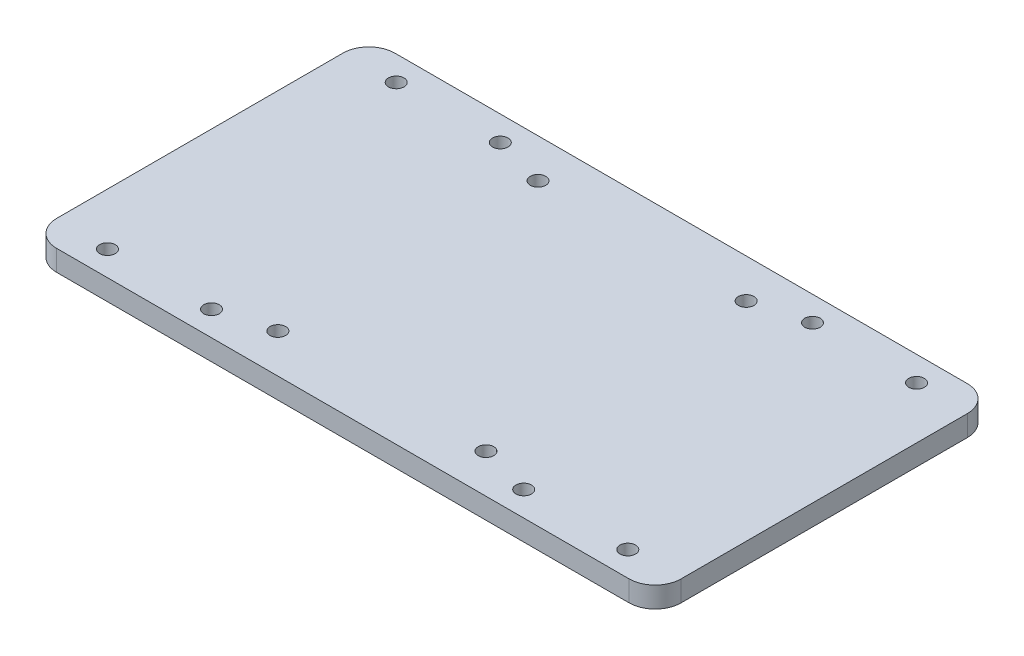
ISO-10303-21;
HEADER;
FILE_DESCRIPTION(('STEP AP214'),'2;1');
FILE_NAME('part.step','',(''),(''),'','','');
FILE_SCHEMA(('AUTOMOTIVE_DESIGN { 1 0 10303 214 1 1 1 1 }'));
ENDSEC;
DATA;
#1=APPLICATION_CONTEXT('core data for automotive mechanical design processes');
#2=APPLICATION_PROTOCOL_DEFINITION('international standard','automotive_design',2000,#1);
#3=PRODUCT_CONTEXT('',#1,'mechanical');
#4=PRODUCT('Part','Part','',(#3));
#5=PRODUCT_RELATED_PRODUCT_CATEGORY('part','',(#4));
#6=PRODUCT_DEFINITION_FORMATION('','',#4);
#7=PRODUCT_DEFINITION_CONTEXT('part definition',#1,'design');
#8=PRODUCT_DEFINITION('design','',#6,#7);
#9=PRODUCT_DEFINITION_SHAPE('','',#8);
#10=(LENGTH_UNIT() NAMED_UNIT(*) SI_UNIT(.MILLI.,.METRE.));
#11=(NAMED_UNIT(*) PLANE_ANGLE_UNIT() SI_UNIT($,.RADIAN.));
#12=(NAMED_UNIT(*) SI_UNIT($,.STERADIAN.) SOLID_ANGLE_UNIT());
#13=UNCERTAINTY_MEASURE_WITH_UNIT(LENGTH_MEASURE(1.E-05),#10,'distance_accuracy_value','');
#14=(GEOMETRIC_REPRESENTATION_CONTEXT(3) GLOBAL_UNCERTAINTY_ASSIGNED_CONTEXT((#13)) GLOBAL_UNIT_ASSIGNED_CONTEXT((#10,
#11,#12)) REPRESENTATION_CONTEXT('',''));
#15=CARTESIAN_POINT('',(0.,0.,0.));
#16=DIRECTION('',(0.,0.,1.));
#17=DIRECTION('',(1.,0.,0.));
#18=AXIS2_PLACEMENT_3D('',#15,#16,#17);
#19=CARTESIAN_POINT('',(60.,4.,32.5));
#20=DIRECTION('',(-1.,0.,0.));
#21=DIRECTION('',(0.,0.,1.));
#22=AXIS2_PLACEMENT_3D('',#19,#20,#21);
#23=PLANE('',#22);
#24=DIRECTION('',(0.,0.,-1.));
#25=VECTOR('',#24,1.);
#26=CARTESIAN_POINT('',(60.,4.,32.5));
#27=LINE('',#26,#25);
#28=CARTESIAN_POINT('',(60.,4.,27.5));
#29=VERTEX_POINT('',#28);
#30=CARTESIAN_POINT('',(60.,4.,-27.5));
#31=VERTEX_POINT('',#30);
#32=EDGE_CURVE('E133',#29,#31,#27,.T.);
#33=ORIENTED_EDGE('',*,*,#32,.F.);
#34=DIRECTION('',(0.,-1.,0.));
#35=VECTOR('',#34,1.);
#36=CARTESIAN_POINT('',(60.,4.,27.5));
#37=LINE('',#36,#35);
#38=CARTESIAN_POINT('',(60.,0.,27.5));
#39=VERTEX_POINT('',#38);
#40=EDGE_CURVE('E159',#29,#39,#37,.T.);
#41=ORIENTED_EDGE('',*,*,#40,.T.);
#42=DIRECTION('',(0.,0.,-1.));
#43=VECTOR('',#42,1.);
#44=CARTESIAN_POINT('',(60.,0.,32.5));
#45=LINE('',#44,#43);
#46=CARTESIAN_POINT('',(60.,0.,-27.5));
#47=VERTEX_POINT('',#46);
#48=EDGE_CURVE('E165',#39,#47,#45,.T.);
#49=ORIENTED_EDGE('',*,*,#48,.T.);
#50=DIRECTION('',(0.,-1.,0.));
#51=VECTOR('',#50,1.);
#52=CARTESIAN_POINT('',(60.,4.,-27.5));
#53=LINE('',#52,#51);
#54=EDGE_CURVE('E157',#47,#31,#53,.F.);
#55=ORIENTED_EDGE('',*,*,#54,.T.);
#56=EDGE_LOOP('',(#33,#41,#49,#55));
#57=FACE_BOUND('',#56,.T.);
#58=ADVANCED_FACE('F41',(#57),#23,.F.);
#59=CARTESIAN_POINT('',(-60.,4.,-32.5));
#60=DIRECTION('',(0.,0.,1.));
#61=DIRECTION('',(1.,0.,0.));
#62=AXIS2_PLACEMENT_3D('',#59,#60,#61);
#63=PLANE('',#62);
#64=DIRECTION('',(-1.,0.,0.));
#65=VECTOR('',#64,1.);
#66=CARTESIAN_POINT('',(-60.,4.,-32.5));
#67=LINE('',#66,#65);
#68=CARTESIAN_POINT('',(55.,4.,-32.5));
#69=VERTEX_POINT('',#68);
#70=CARTESIAN_POINT('',(-55.,4.,-32.5));
#71=VERTEX_POINT('',#70);
#72=EDGE_CURVE('E136',#69,#71,#67,.T.);
#73=ORIENTED_EDGE('',*,*,#72,.F.);
#74=DIRECTION('',(0.,-1.,0.));
#75=VECTOR('',#74,1.);
#76=CARTESIAN_POINT('',(55.,4.,-32.5));
#77=LINE('',#76,#75);
#78=CARTESIAN_POINT('',(55.,0.,-32.5));
#79=VERTEX_POINT('',#78);
#80=EDGE_CURVE('E11',#69,#79,#77,.T.);
#81=ORIENTED_EDGE('',*,*,#80,.T.);
#82=DIRECTION('',(-1.,0.,0.));
#83=VECTOR('',#82,1.);
#84=CARTESIAN_POINT('',(-60.,0.,-32.5));
#85=LINE('',#84,#83);
#86=CARTESIAN_POINT('',(-55.,0.,-32.5));
#87=VERTEX_POINT('',#86);
#88=EDGE_CURVE('E138',#79,#87,#85,.T.);
#89=ORIENTED_EDGE('',*,*,#88,.T.);
#90=DIRECTION('',(0.,-1.,0.));
#91=VECTOR('',#90,1.);
#92=CARTESIAN_POINT('',(-55.,4.,-32.5));
#93=LINE('',#92,#91);
#94=EDGE_CURVE('E49',#87,#71,#93,.F.);
#95=ORIENTED_EDGE('',*,*,#94,.T.);
#96=EDGE_LOOP('',(#73,#81,#89,#95));
#97=FACE_BOUND('',#96,.T.);
#98=ADVANCED_FACE('F280',(#97),#63,.F.);
#99=CARTESIAN_POINT('',(-60.,4.,32.5));
#100=DIRECTION('',(1.,0.,0.));
#101=DIRECTION('',(0.,0.,-1.));
#102=AXIS2_PLACEMENT_3D('',#99,#100,#101);
#103=PLANE('',#102);
#104=DIRECTION('',(0.,0.,1.));
#105=VECTOR('',#104,1.);
#106=CARTESIAN_POINT('',(-60.,0.,32.5));
#107=LINE('',#106,#105);
#108=CARTESIAN_POINT('',(-60.,0.,-27.5));
#109=VERTEX_POINT('',#108);
#110=CARTESIAN_POINT('',(-60.,0.,27.5));
#111=VERTEX_POINT('',#110);
#112=EDGE_CURVE('E134',#109,#111,#107,.T.);
#113=ORIENTED_EDGE('',*,*,#112,.T.);
#114=DIRECTION('',(0.,-1.,0.));
#115=VECTOR('',#114,1.);
#116=CARTESIAN_POINT('',(-60.,4.,27.5));
#117=LINE('',#116,#115);
#118=CARTESIAN_POINT('',(-60.,4.,27.5));
#119=VERTEX_POINT('',#118);
#120=EDGE_CURVE('E112',#111,#119,#117,.F.);
#121=ORIENTED_EDGE('',*,*,#120,.T.);
#122=DIRECTION('',(0.,0.,1.));
#123=VECTOR('',#122,1.);
#124=CARTESIAN_POINT('',(-60.,4.,32.5));
#125=LINE('',#124,#123);
#126=CARTESIAN_POINT('',(-60.,4.,-27.5));
#127=VERTEX_POINT('',#126);
#128=EDGE_CURVE('E177',#127,#119,#125,.T.);
#129=ORIENTED_EDGE('',*,*,#128,.F.);
#130=DIRECTION('',(0.,-1.,0.));
#131=VECTOR('',#130,1.);
#132=CARTESIAN_POINT('',(-60.,4.,-27.5));
#133=LINE('',#132,#131);
#134=EDGE_CURVE('E117',#127,#109,#133,.T.);
#135=ORIENTED_EDGE('',*,*,#134,.T.);
#136=EDGE_LOOP('',(#113,#121,#129,#135));
#137=FACE_BOUND('',#136,.T.);
#138=ADVANCED_FACE('F278',(#137),#103,.F.);
#139=CARTESIAN_POINT('',(-60.,4.,32.5));
#140=DIRECTION('',(0.,0.,-1.));
#141=DIRECTION('',(-1.,0.,0.));
#142=AXIS2_PLACEMENT_3D('',#139,#140,#141);
#143=PLANE('',#142);
#144=DIRECTION('',(1.,0.,0.));
#145=VECTOR('',#144,1.);
#146=CARTESIAN_POINT('',(-60.,4.,32.5));
#147=LINE('',#146,#145);
#148=CARTESIAN_POINT('',(-55.,4.,32.5));
#149=VERTEX_POINT('',#148);
#150=CARTESIAN_POINT('',(55.,4.,32.5));
#151=VERTEX_POINT('',#150);
#152=EDGE_CURVE('E127',#149,#151,#147,.T.);
#153=ORIENTED_EDGE('',*,*,#152,.F.);
#154=DIRECTION('',(0.,-1.,0.));
#155=VECTOR('',#154,1.);
#156=CARTESIAN_POINT('',(-55.,4.,32.5));
#157=LINE('',#156,#155);
#158=CARTESIAN_POINT('',(-55.,0.,32.5));
#159=VERTEX_POINT('',#158);
#160=EDGE_CURVE('E111',#149,#159,#157,.T.);
#161=ORIENTED_EDGE('',*,*,#160,.T.);
#162=DIRECTION('',(1.,0.,0.));
#163=VECTOR('',#162,1.);
#164=CARTESIAN_POINT('',(-60.,0.,32.5));
#165=LINE('',#164,#163);
#166=CARTESIAN_POINT('',(55.,0.,32.5));
#167=VERTEX_POINT('',#166);
#168=EDGE_CURVE('E124',#159,#167,#165,.T.);
#169=ORIENTED_EDGE('',*,*,#168,.T.);
#170=DIRECTION('',(0.,-1.,0.));
#171=VECTOR('',#170,1.);
#172=CARTESIAN_POINT('',(55.,4.,32.5));
#173=LINE('',#172,#171);
#174=EDGE_CURVE('E129',#167,#151,#173,.F.);
#175=ORIENTED_EDGE('',*,*,#174,.T.);
#176=EDGE_LOOP('',(#153,#161,#169,#175));
#177=FACE_BOUND('',#176,.T.);
#178=ADVANCED_FACE('F123',(#177),#143,.F.);
#179=CARTESIAN_POINT('',(0.,4.,0.));
#180=DIRECTION('',(0.,-1.,0.));
#181=DIRECTION('',(0.,0.,-1.));
#182=AXIS2_PLACEMENT_3D('',#179,#180,#181);
#183=PLANE('',#182);
#184=CARTESIAN_POINT('',(-19.9999999999995,4.,25.));
#185=DIRECTION('',(0.,1.,0.));
#186=DIRECTION('',(0.,0.,1.));
#187=AXIS2_PLACEMENT_3D('',#184,#185,#186);
#188=CIRCLE('',#187,1.5);
#189=CARTESIAN_POINT('',(-19.9999999999995,4.,26.5));
#190=VERTEX_POINT('',#189);
#191=EDGE_CURVE('E235',#190,#190,#188,.T.);
#192=ORIENTED_EDGE('',*,*,#191,.F.);
#193=EDGE_LOOP('',(#192));
#194=FACE_BOUND('',#193,.T.);
#195=CARTESIAN_POINT('',(20.0000000000005,4.,25.));
#196=DIRECTION('',(0.,1.,0.));
#197=DIRECTION('',(0.,0.,1.));
#198=AXIS2_PLACEMENT_3D('',#195,#196,#197);
#199=CIRCLE('',#198,1.5);
#200=CARTESIAN_POINT('',(20.0000000000005,4.,26.5));
#201=VERTEX_POINT('',#200);
#202=EDGE_CURVE('E241',#201,#201,#199,.T.);
#203=ORIENTED_EDGE('',*,*,#202,.F.);
#204=EDGE_LOOP('',(#203));
#205=FACE_BOUND('',#204,.T.);
#206=CARTESIAN_POINT('',(20.,4.,-25.));
#207=DIRECTION('',(0.,1.,0.));
#208=DIRECTION('',(0.,0.,1.));
#209=AXIS2_PLACEMENT_3D('',#206,#207,#208);
#210=CIRCLE('',#209,1.5);
#211=CARTESIAN_POINT('',(20.,4.,-23.5));
#212=VERTEX_POINT('',#211);
#213=EDGE_CURVE('E229',#212,#212,#210,.T.);
#214=ORIENTED_EDGE('',*,*,#213,.F.);
#215=EDGE_LOOP('',(#214));
#216=FACE_BOUND('',#215,.T.);
#217=CARTESIAN_POINT('',(-20.,4.,-25.));
#218=DIRECTION('',(0.,1.,0.));
#219=DIRECTION('',(0.,0.,1.));
#220=AXIS2_PLACEMENT_3D('',#217,#218,#219);
#221=CIRCLE('',#220,1.5);
#222=CARTESIAN_POINT('',(-20.,4.,-23.5));
#223=VERTEX_POINT('',#222);
#224=EDGE_CURVE('E226',#223,#223,#221,.T.);
#225=ORIENTED_EDGE('',*,*,#224,.F.);
#226=EDGE_LOOP('',(#225));
#227=FACE_BOUND('',#226,.T.);
#228=CARTESIAN_POINT('',(-30.,4.,27.75));
#229=DIRECTION('',(0.,-1.,0.));
#230=DIRECTION('',(0.,0.,1.));
#231=AXIS2_PLACEMENT_3D('',#228,#229,#230);
#232=CIRCLE('',#231,1.50000000000001);
#233=CARTESIAN_POINT('',(-30.,4.,29.25));
#234=VERTEX_POINT('',#233);
#235=EDGE_CURVE('E208',#234,#234,#232,.T.);
#236=ORIENTED_EDGE('',*,*,#235,.T.);
#237=EDGE_LOOP('',(#236));
#238=FACE_BOUND('',#237,.T.);
#239=CARTESIAN_POINT('',(-30.,4.,-27.75));
#240=DIRECTION('',(0.,-1.,0.));
#241=DIRECTION('',(0.,0.,1.));
#242=AXIS2_PLACEMENT_3D('',#239,#240,#241);
#243=CIRCLE('',#242,1.5);
#244=CARTESIAN_POINT('',(-30.,4.,-26.25));
#245=VERTEX_POINT('',#244);
#246=EDGE_CURVE('E215',#245,#245,#243,.T.);
#247=ORIENTED_EDGE('',*,*,#246,.T.);
#248=EDGE_LOOP('',(#247));
#249=FACE_BOUND('',#248,.T.);
#250=CARTESIAN_POINT('',(-50.,4.,-27.75));
#251=DIRECTION('',(0.,-1.,0.));
#252=DIRECTION('',(0.,0.,1.));
#253=AXIS2_PLACEMENT_3D('',#250,#251,#252);
#254=CIRCLE('',#253,1.5);
#255=CARTESIAN_POINT('',(-50.,4.,-26.25));
#256=VERTEX_POINT('',#255);
#257=EDGE_CURVE('E221',#256,#256,#254,.T.);
#258=ORIENTED_EDGE('',*,*,#257,.T.);
#259=EDGE_LOOP('',(#258));
#260=FACE_BOUND('',#259,.T.);
#261=CARTESIAN_POINT('',(-50.,4.,27.75));
#262=DIRECTION('',(0.,-1.,0.));
#263=DIRECTION('',(0.,0.,1.));
#264=AXIS2_PLACEMENT_3D('',#261,#262,#263);
#265=CIRCLE('',#264,1.5);
#266=CARTESIAN_POINT('',(-50.,4.,29.25));
#267=VERTEX_POINT('',#266);
#268=EDGE_CURVE('E202',#267,#267,#265,.T.);
#269=ORIENTED_EDGE('',*,*,#268,.T.);
#270=EDGE_LOOP('',(#269));
#271=FACE_BOUND('',#270,.T.);
#272=CARTESIAN_POINT('',(30.,4.,27.75));
#273=DIRECTION('',(0.,1.,0.));
#274=DIRECTION('',(0.,0.,1.));
#275=AXIS2_PLACEMENT_3D('',#272,#273,#274);
#276=CIRCLE('',#275,1.50000000000001);
#277=CARTESIAN_POINT('',(30.,4.,29.25));
#278=VERTEX_POINT('',#277);
#279=EDGE_CURVE('E187',#278,#278,#276,.T.);
#280=ORIENTED_EDGE('',*,*,#279,.F.);
#281=EDGE_LOOP('',(#280));
#282=FACE_BOUND('',#281,.T.);
#283=CARTESIAN_POINT('',(30.,4.,-27.75));
#284=DIRECTION('',(0.,1.,0.));
#285=DIRECTION('',(0.,0.,1.));
#286=AXIS2_PLACEMENT_3D('',#283,#284,#285);
#287=CIRCLE('',#286,1.5);
#288=CARTESIAN_POINT('',(30.,4.,-26.25));
#289=VERTEX_POINT('',#288);
#290=EDGE_CURVE('E194',#289,#289,#287,.T.);
#291=ORIENTED_EDGE('',*,*,#290,.F.);
#292=EDGE_LOOP('',(#291));
#293=FACE_BOUND('',#292,.T.);
#294=CARTESIAN_POINT('',(50.,4.,-27.75));
#295=DIRECTION('',(0.,1.,0.));
#296=DIRECTION('',(0.,0.,1.));
#297=AXIS2_PLACEMENT_3D('',#294,#295,#296);
#298=CIRCLE('',#297,1.5);
#299=CARTESIAN_POINT('',(50.,4.,-26.25));
#300=VERTEX_POINT('',#299);
#301=EDGE_CURVE('E182',#300,#300,#298,.T.);
#302=ORIENTED_EDGE('',*,*,#301,.F.);
#303=EDGE_LOOP('',(#302));
#304=FACE_BOUND('',#303,.T.);
#305=CARTESIAN_POINT('',(50.,4.,27.75));
#306=DIRECTION('',(0.,1.,0.));
#307=DIRECTION('',(0.,0.,1.));
#308=AXIS2_PLACEMENT_3D('',#305,#306,#307);
#309=CIRCLE('',#308,1.5);
#310=CARTESIAN_POINT('',(50.,4.,29.25));
#311=VERTEX_POINT('',#310);
#312=EDGE_CURVE('E173',#311,#311,#309,.T.);
#313=ORIENTED_EDGE('',*,*,#312,.F.);
#314=EDGE_LOOP('',(#313));
#315=FACE_BOUND('',#314,.T.);
#316=ORIENTED_EDGE('',*,*,#128,.T.);
#317=CARTESIAN_POINT('',(-55.,4.,27.5));
#318=DIRECTION('',(0.,-1.,0.));
#319=DIRECTION('',(0.,0.,-1.));
#320=AXIS2_PLACEMENT_3D('',#317,#318,#319);
#321=CIRCLE('',#320,5.);
#322=EDGE_CURVE('E155',#119,#149,#321,.F.);
#323=ORIENTED_EDGE('',*,*,#322,.T.);
#324=ORIENTED_EDGE('',*,*,#152,.T.);
#325=CARTESIAN_POINT('',(55.,4.,27.5));
#326=DIRECTION('',(0.,-1.,0.));
#327=DIRECTION('',(0.,0.,-1.));
#328=AXIS2_PLACEMENT_3D('',#325,#326,#327);
#329=CIRCLE('',#328,5.);
#330=EDGE_CURVE('E153',#151,#29,#329,.F.);
#331=ORIENTED_EDGE('',*,*,#330,.T.);
#332=ORIENTED_EDGE('',*,*,#32,.T.);
#333=CARTESIAN_POINT('',(55.,4.,-27.5));
#334=DIRECTION('',(0.,-1.,0.));
#335=DIRECTION('',(0.,0.,-1.));
#336=AXIS2_PLACEMENT_3D('',#333,#334,#335);
#337=CIRCLE('',#336,5.);
#338=EDGE_CURVE('E62',#31,#69,#337,.F.);
#339=ORIENTED_EDGE('',*,*,#338,.T.);
#340=ORIENTED_EDGE('',*,*,#72,.T.);
#341=CARTESIAN_POINT('',(-55.,4.,-27.5));
#342=DIRECTION('',(0.,-1.,0.));
#343=DIRECTION('',(0.,0.,-1.));
#344=AXIS2_PLACEMENT_3D('',#341,#342,#343);
#345=CIRCLE('',#344,5.);
#346=EDGE_CURVE('E150',#71,#127,#345,.F.);
#347=ORIENTED_EDGE('',*,*,#346,.T.);
#348=EDGE_LOOP('',(#316,#323,#324,#331,#332,#339,#340,#347));
#349=FACE_BOUND('',#348,.T.);
#350=ADVANCED_FACE('F252',(#194,#205,#216,#227,#238,#249,#260,#271,#282,#293,#304,#315,#349),
#183,.F.);
#351=CARTESIAN_POINT('',(0.,0.,0.));
#352=DIRECTION('',(0.,-1.,0.));
#353=DIRECTION('',(0.,0.,-1.));
#354=AXIS2_PLACEMENT_3D('',#351,#352,#353);
#355=PLANE('',#354);
#356=CARTESIAN_POINT('',(-19.9999999999995,0.,25.));
#357=DIRECTION('',(0.,1.,0.));
#358=DIRECTION('',(0.,0.,1.));
#359=AXIS2_PLACEMENT_3D('',#356,#357,#358);
#360=CIRCLE('',#359,1.5);
#361=CARTESIAN_POINT('',(-19.9999999999995,0.,26.5));
#362=VERTEX_POINT('',#361);
#363=EDGE_CURVE('E232',#362,#362,#360,.T.);
#364=ORIENTED_EDGE('',*,*,#363,.T.);
#365=EDGE_LOOP('',(#364));
#366=FACE_BOUND('',#365,.T.);
#367=CARTESIAN_POINT('',(20.0000000000005,0.,25.));
#368=DIRECTION('',(0.,1.,0.));
#369=DIRECTION('',(0.,0.,1.));
#370=AXIS2_PLACEMENT_3D('',#367,#368,#369);
#371=CIRCLE('',#370,1.5);
#372=CARTESIAN_POINT('',(20.0000000000005,0.,26.5));
#373=VERTEX_POINT('',#372);
#374=EDGE_CURVE('E238',#373,#373,#371,.T.);
#375=ORIENTED_EDGE('',*,*,#374,.T.);
#376=EDGE_LOOP('',(#375));
#377=FACE_BOUND('',#376,.T.);
#378=CARTESIAN_POINT('',(20.,0.,-25.));
#379=DIRECTION('',(0.,1.,0.));
#380=DIRECTION('',(0.,0.,1.));
#381=AXIS2_PLACEMENT_3D('',#378,#379,#380);
#382=CIRCLE('',#381,1.5);
#383=CARTESIAN_POINT('',(20.,0.,-23.5));
#384=VERTEX_POINT('',#383);
#385=EDGE_CURVE('E244',#384,#384,#382,.T.);
#386=ORIENTED_EDGE('',*,*,#385,.T.);
#387=EDGE_LOOP('',(#386));
#388=FACE_BOUND('',#387,.T.);
#389=CARTESIAN_POINT('',(-20.,0.,-25.));
#390=DIRECTION('',(0.,1.,0.));
#391=DIRECTION('',(0.,0.,1.));
#392=AXIS2_PLACEMENT_3D('',#389,#390,#391);
#393=CIRCLE('',#392,1.5);
#394=CARTESIAN_POINT('',(-20.,0.,-23.5));
#395=VERTEX_POINT('',#394);
#396=EDGE_CURVE('E212',#395,#395,#393,.T.);
#397=ORIENTED_EDGE('',*,*,#396,.T.);
#398=EDGE_LOOP('',(#397));
#399=FACE_BOUND('',#398,.T.);
#400=CARTESIAN_POINT('',(-30.,0.,27.75));
#401=DIRECTION('',(0.,-1.,0.));
#402=DIRECTION('',(0.,0.,1.));
#403=AXIS2_PLACEMENT_3D('',#400,#401,#402);
#404=CIRCLE('',#403,1.50000000000001);
#405=CARTESIAN_POINT('',(-30.,0.,29.25));
#406=VERTEX_POINT('',#405);
#407=EDGE_CURVE('E211',#406,#406,#404,.T.);
#408=ORIENTED_EDGE('',*,*,#407,.F.);
#409=EDGE_LOOP('',(#408));
#410=FACE_BOUND('',#409,.T.);
#411=CARTESIAN_POINT('',(-30.,0.,-27.75));
#412=DIRECTION('',(0.,-1.,0.));
#413=DIRECTION('',(0.,0.,1.));
#414=AXIS2_PLACEMENT_3D('',#411,#412,#413);
#415=CIRCLE('',#414,1.5);
#416=CARTESIAN_POINT('',(-30.,0.,-26.25));
#417=VERTEX_POINT('',#416);
#418=EDGE_CURVE('E218',#417,#417,#415,.T.);
#419=ORIENTED_EDGE('',*,*,#418,.F.);
#420=EDGE_LOOP('',(#419));
#421=FACE_BOUND('',#420,.T.);
#422=CARTESIAN_POINT('',(-50.,0.,-27.75));
#423=DIRECTION('',(0.,-1.,0.));
#424=DIRECTION('',(0.,0.,1.));
#425=AXIS2_PLACEMENT_3D('',#422,#423,#424);
#426=CIRCLE('',#425,1.5);
#427=CARTESIAN_POINT('',(-50.,0.,-26.25));
#428=VERTEX_POINT('',#427);
#429=EDGE_CURVE('E205',#428,#428,#426,.T.);
#430=ORIENTED_EDGE('',*,*,#429,.F.);
#431=EDGE_LOOP('',(#430));
#432=FACE_BOUND('',#431,.T.);
#433=CARTESIAN_POINT('',(-50.,0.,27.75));
#434=DIRECTION('',(0.,-1.,0.));
#435=DIRECTION('',(0.,0.,1.));
#436=AXIS2_PLACEMENT_3D('',#433,#434,#435);
#437=CIRCLE('',#436,1.5);
#438=CARTESIAN_POINT('',(-50.,0.,29.25));
#439=VERTEX_POINT('',#438);
#440=EDGE_CURVE('E188',#439,#439,#437,.T.);
#441=ORIENTED_EDGE('',*,*,#440,.F.);
#442=EDGE_LOOP('',(#441));
#443=FACE_BOUND('',#442,.T.);
#444=CARTESIAN_POINT('',(30.,0.,27.75));
#445=DIRECTION('',(0.,1.,0.));
#446=DIRECTION('',(0.,0.,1.));
#447=AXIS2_PLACEMENT_3D('',#444,#445,#446);
#448=CIRCLE('',#447,1.50000000000001);
#449=CARTESIAN_POINT('',(30.,0.,29.25));
#450=VERTEX_POINT('',#449);
#451=EDGE_CURVE('E184',#450,#450,#448,.T.);
#452=ORIENTED_EDGE('',*,*,#451,.T.);
#453=EDGE_LOOP('',(#452));
#454=FACE_BOUND('',#453,.T.);
#455=CARTESIAN_POINT('',(30.,0.,-27.75));
#456=DIRECTION('',(0.,1.,0.));
#457=DIRECTION('',(0.,0.,1.));
#458=AXIS2_PLACEMENT_3D('',#455,#456,#457);
#459=CIRCLE('',#458,1.5);
#460=CARTESIAN_POINT('',(30.,0.,-26.25));
#461=VERTEX_POINT('',#460);
#462=EDGE_CURVE('E191',#461,#461,#459,.T.);
#463=ORIENTED_EDGE('',*,*,#462,.T.);
#464=EDGE_LOOP('',(#463));
#465=FACE_BOUND('',#464,.T.);
#466=CARTESIAN_POINT('',(50.,0.,-27.75));
#467=DIRECTION('',(0.,1.,0.));
#468=DIRECTION('',(0.,0.,1.));
#469=AXIS2_PLACEMENT_3D('',#466,#467,#468);
#470=CIRCLE('',#469,1.5);
#471=CARTESIAN_POINT('',(50.,0.,-26.25));
#472=VERTEX_POINT('',#471);
#473=EDGE_CURVE('E197',#472,#472,#470,.T.);
#474=ORIENTED_EDGE('',*,*,#473,.T.);
#475=EDGE_LOOP('',(#474));
#476=FACE_BOUND('',#475,.T.);
#477=CARTESIAN_POINT('',(50.,0.,27.75));
#478=DIRECTION('',(0.,1.,0.));
#479=DIRECTION('',(0.,0.,1.));
#480=AXIS2_PLACEMENT_3D('',#477,#478,#479);
#481=CIRCLE('',#480,1.5);
#482=CARTESIAN_POINT('',(50.,0.,29.25));
#483=VERTEX_POINT('',#482);
#484=EDGE_CURVE('E170',#483,#483,#481,.T.);
#485=ORIENTED_EDGE('',*,*,#484,.T.);
#486=EDGE_LOOP('',(#485));
#487=FACE_BOUND('',#486,.T.);
#488=ORIENTED_EDGE('',*,*,#168,.F.);
#489=CARTESIAN_POINT('',(-55.,0.,27.5));
#490=DIRECTION('',(0.,-1.,0.));
#491=DIRECTION('',(0.,0.,-1.));
#492=AXIS2_PLACEMENT_3D('',#489,#490,#491);
#493=CIRCLE('',#492,5.);
#494=EDGE_CURVE('E107',#159,#111,#493,.T.);
#495=ORIENTED_EDGE('',*,*,#494,.T.);
#496=ORIENTED_EDGE('',*,*,#112,.F.);
#497=CARTESIAN_POINT('',(-55.,0.,-27.5));
#498=DIRECTION('',(0.,-1.,0.));
#499=DIRECTION('',(0.,0.,-1.));
#500=AXIS2_PLACEMENT_3D('',#497,#498,#499);
#501=CIRCLE('',#500,5.);
#502=EDGE_CURVE('E128',#109,#87,#501,.T.);
#503=ORIENTED_EDGE('',*,*,#502,.T.);
#504=ORIENTED_EDGE('',*,*,#88,.F.);
#505=CARTESIAN_POINT('',(55.,0.,-27.5));
#506=DIRECTION('',(0.,-1.,0.));
#507=DIRECTION('',(0.,0.,-1.));
#508=AXIS2_PLACEMENT_3D('',#505,#506,#507);
#509=CIRCLE('',#508,5.);
#510=EDGE_CURVE('E144',#79,#47,#509,.T.);
#511=ORIENTED_EDGE('',*,*,#510,.T.);
#512=ORIENTED_EDGE('',*,*,#48,.F.);
#513=CARTESIAN_POINT('',(55.,0.,27.5));
#514=DIRECTION('',(0.,-1.,0.));
#515=DIRECTION('',(0.,0.,-1.));
#516=AXIS2_PLACEMENT_3D('',#513,#514,#515);
#517=CIRCLE('',#516,5.);
#518=EDGE_CURVE('E118',#39,#167,#517,.T.);
#519=ORIENTED_EDGE('',*,*,#518,.T.);
#520=EDGE_LOOP('',(#488,#495,#496,#503,#504,#511,#512,#519));
#521=FACE_BOUND('',#520,.T.);
#522=ADVANCED_FACE('F131',(#366,#377,#388,#399,#410,#421,#432,#443,#454,#465,#476,#487,#521),
#355,.T.);
#523=CARTESIAN_POINT('',(50.,0.,27.75));
#524=DIRECTION('',(0.,1.,0.));
#525=DIRECTION('',(0.,0.,1.));
#526=AXIS2_PLACEMENT_3D('',#523,#524,#525);
#527=CYLINDRICAL_SURFACE('',#526,1.5);
#528=ORIENTED_EDGE('',*,*,#484,.F.);
#529=EDGE_LOOP('',(#528));
#530=FACE_BOUND('',#529,.T.);
#531=ORIENTED_EDGE('',*,*,#312,.T.);
#532=EDGE_LOOP('',(#531));
#533=FACE_BOUND('',#532,.T.);
#534=ADVANCED_FACE('F306',(#530,#533),#527,.F.);
#535=CARTESIAN_POINT('',(50.,0.,-27.75));
#536=DIRECTION('',(0.,1.,0.));
#537=DIRECTION('',(0.,0.,1.));
#538=AXIS2_PLACEMENT_3D('',#535,#536,#537);
#539=CYLINDRICAL_SURFACE('',#538,1.5);
#540=ORIENTED_EDGE('',*,*,#473,.F.);
#541=EDGE_LOOP('',(#540));
#542=FACE_BOUND('',#541,.T.);
#543=ORIENTED_EDGE('',*,*,#301,.T.);
#544=EDGE_LOOP('',(#543));
#545=FACE_BOUND('',#544,.T.);
#546=ADVANCED_FACE('F311',(#542,#545),#539,.F.);
#547=CARTESIAN_POINT('',(30.,0.,-27.75));
#548=DIRECTION('',(0.,1.,0.));
#549=DIRECTION('',(0.,0.,1.));
#550=AXIS2_PLACEMENT_3D('',#547,#548,#549);
#551=CYLINDRICAL_SURFACE('',#550,1.5);
#552=ORIENTED_EDGE('',*,*,#462,.F.);
#553=EDGE_LOOP('',(#552));
#554=FACE_BOUND('',#553,.T.);
#555=ORIENTED_EDGE('',*,*,#290,.T.);
#556=EDGE_LOOP('',(#555));
#557=FACE_BOUND('',#556,.T.);
#558=ADVANCED_FACE('F317',(#554,#557),#551,.F.);
#559=CARTESIAN_POINT('',(30.,0.,27.75));
#560=DIRECTION('',(0.,1.,0.));
#561=DIRECTION('',(0.,0.,1.));
#562=AXIS2_PLACEMENT_3D('',#559,#560,#561);
#563=CYLINDRICAL_SURFACE('',#562,1.50000000000001);
#564=ORIENTED_EDGE('',*,*,#451,.F.);
#565=EDGE_LOOP('',(#564));
#566=FACE_BOUND('',#565,.T.);
#567=ORIENTED_EDGE('',*,*,#279,.T.);
#568=EDGE_LOOP('',(#567));
#569=FACE_BOUND('',#568,.T.);
#570=ADVANCED_FACE('F313',(#566,#569),#563,.F.);
#571=CARTESIAN_POINT('',(-50.,0.,27.75));
#572=DIRECTION('',(0.,1.,0.));
#573=DIRECTION('',(0.,0.,1.));
#574=AXIS2_PLACEMENT_3D('',#571,#572,#573);
#575=CYLINDRICAL_SURFACE('',#574,1.5);
#576=ORIENTED_EDGE('',*,*,#440,.T.);
#577=EDGE_LOOP('',(#576));
#578=FACE_BOUND('',#577,.T.);
#579=ORIENTED_EDGE('',*,*,#268,.F.);
#580=EDGE_LOOP('',(#579));
#581=FACE_BOUND('',#580,.T.);
#582=ADVANCED_FACE('F316',(#578,#581),#575,.F.);
#583=CARTESIAN_POINT('',(-50.,0.,-27.75));
#584=DIRECTION('',(0.,1.,0.));
#585=DIRECTION('',(0.,0.,1.));
#586=AXIS2_PLACEMENT_3D('',#583,#584,#585);
#587=CYLINDRICAL_SURFACE('',#586,1.5);
#588=ORIENTED_EDGE('',*,*,#429,.T.);
#589=EDGE_LOOP('',(#588));
#590=FACE_BOUND('',#589,.T.);
#591=ORIENTED_EDGE('',*,*,#257,.F.);
#592=EDGE_LOOP('',(#591));
#593=FACE_BOUND('',#592,.T.);
#594=ADVANCED_FACE('F327',(#590,#593),#587,.F.);
#595=CARTESIAN_POINT('',(-30.,0.,-27.75));
#596=DIRECTION('',(0.,1.,0.));
#597=DIRECTION('',(0.,0.,1.));
#598=AXIS2_PLACEMENT_3D('',#595,#596,#597);
#599=CYLINDRICAL_SURFACE('',#598,1.5);
#600=ORIENTED_EDGE('',*,*,#418,.T.);
#601=EDGE_LOOP('',(#600));
#602=FACE_BOUND('',#601,.T.);
#603=ORIENTED_EDGE('',*,*,#246,.F.);
#604=EDGE_LOOP('',(#603));
#605=FACE_BOUND('',#604,.T.);
#606=ADVANCED_FACE('F330',(#602,#605),#599,.F.);
#607=CARTESIAN_POINT('',(-30.,0.,27.75));
#608=DIRECTION('',(0.,1.,0.));
#609=DIRECTION('',(0.,0.,1.));
#610=AXIS2_PLACEMENT_3D('',#607,#608,#609);
#611=CYLINDRICAL_SURFACE('',#610,1.50000000000001);
#612=ORIENTED_EDGE('',*,*,#407,.T.);
#613=EDGE_LOOP('',(#612));
#614=FACE_BOUND('',#613,.T.);
#615=ORIENTED_EDGE('',*,*,#235,.F.);
#616=EDGE_LOOP('',(#615));
#617=FACE_BOUND('',#616,.T.);
#618=ADVANCED_FACE('F291',(#614,#617),#611,.F.);
#619=CARTESIAN_POINT('',(-55.,4.,27.5));
#620=DIRECTION('',(0.,-1.,0.));
#621=DIRECTION('',(0.,0.,-1.));
#622=AXIS2_PLACEMENT_3D('',#619,#620,#621);
#623=CYLINDRICAL_SURFACE('',#622,5.);
#624=ORIENTED_EDGE('',*,*,#322,.F.);
#625=ORIENTED_EDGE('',*,*,#120,.F.);
#626=ORIENTED_EDGE('',*,*,#494,.F.);
#627=ORIENTED_EDGE('',*,*,#160,.F.);
#628=EDGE_LOOP('',(#624,#625,#626,#627));
#629=FACE_BOUND('',#628,.T.);
#630=ADVANCED_FACE('F110',(#629),#623,.T.);
#631=CARTESIAN_POINT('',(55.,4.,27.5));
#632=DIRECTION('',(0.,-1.,0.));
#633=DIRECTION('',(0.,0.,-1.));
#634=AXIS2_PLACEMENT_3D('',#631,#632,#633);
#635=CYLINDRICAL_SURFACE('',#634,5.);
#636=ORIENTED_EDGE('',*,*,#330,.F.);
#637=ORIENTED_EDGE('',*,*,#174,.F.);
#638=ORIENTED_EDGE('',*,*,#518,.F.);
#639=ORIENTED_EDGE('',*,*,#40,.F.);
#640=EDGE_LOOP('',(#636,#637,#638,#639));
#641=FACE_BOUND('',#640,.T.);
#642=ADVANCED_FACE('F284',(#641),#635,.T.);
#643=CARTESIAN_POINT('',(55.,4.,-27.5));
#644=DIRECTION('',(0.,-1.,0.));
#645=DIRECTION('',(0.,0.,-1.));
#646=AXIS2_PLACEMENT_3D('',#643,#644,#645);
#647=CYLINDRICAL_SURFACE('',#646,5.);
#648=ORIENTED_EDGE('',*,*,#338,.F.);
#649=ORIENTED_EDGE('',*,*,#54,.F.);
#650=ORIENTED_EDGE('',*,*,#510,.F.);
#651=ORIENTED_EDGE('',*,*,#80,.F.);
#652=EDGE_LOOP('',(#648,#649,#650,#651));
#653=FACE_BOUND('',#652,.T.);
#654=ADVANCED_FACE('F283',(#653),#647,.T.);
#655=CARTESIAN_POINT('',(-55.,4.,-27.5));
#656=DIRECTION('',(0.,-1.,0.));
#657=DIRECTION('',(0.,0.,-1.));
#658=AXIS2_PLACEMENT_3D('',#655,#656,#657);
#659=CYLINDRICAL_SURFACE('',#658,5.);
#660=ORIENTED_EDGE('',*,*,#346,.F.);
#661=ORIENTED_EDGE('',*,*,#94,.F.);
#662=ORIENTED_EDGE('',*,*,#502,.F.);
#663=ORIENTED_EDGE('',*,*,#134,.F.);
#664=EDGE_LOOP('',(#660,#661,#662,#663));
#665=FACE_BOUND('',#664,.T.);
#666=ADVANCED_FACE('F43',(#665),#659,.T.);
#667=CARTESIAN_POINT('',(-20.,0.,-25.));
#668=DIRECTION('',(0.,1.,0.));
#669=DIRECTION('',(0.,0.,1.));
#670=AXIS2_PLACEMENT_3D('',#667,#668,#669);
#671=CYLINDRICAL_SURFACE('',#670,1.5);
#672=ORIENTED_EDGE('',*,*,#396,.F.);
#673=EDGE_LOOP('',(#672));
#674=FACE_BOUND('',#673,.T.);
#675=ORIENTED_EDGE('',*,*,#224,.T.);
#676=EDGE_LOOP('',(#675));
#677=FACE_BOUND('',#676,.T.);
#678=ADVANCED_FACE('F338',(#674,#677),#671,.F.);
#679=CARTESIAN_POINT('',(20.,0.,-25.));
#680=DIRECTION('',(0.,1.,0.));
#681=DIRECTION('',(0.,0.,1.));
#682=AXIS2_PLACEMENT_3D('',#679,#680,#681);
#683=CYLINDRICAL_SURFACE('',#682,1.5);
#684=ORIENTED_EDGE('',*,*,#385,.F.);
#685=EDGE_LOOP('',(#684));
#686=FACE_BOUND('',#685,.T.);
#687=ORIENTED_EDGE('',*,*,#213,.T.);
#688=EDGE_LOOP('',(#687));
#689=FACE_BOUND('',#688,.T.);
#690=ADVANCED_FACE('F250',(#686,#689),#683,.F.);
#691=CARTESIAN_POINT('',(20.0000000000005,0.,25.));
#692=DIRECTION('',(0.,1.,0.));
#693=DIRECTION('',(0.,0.,1.));
#694=AXIS2_PLACEMENT_3D('',#691,#692,#693);
#695=CYLINDRICAL_SURFACE('',#694,1.5);
#696=ORIENTED_EDGE('',*,*,#374,.F.);
#697=EDGE_LOOP('',(#696));
#698=FACE_BOUND('',#697,.T.);
#699=ORIENTED_EDGE('',*,*,#202,.T.);
#700=EDGE_LOOP('',(#699));
#701=FACE_BOUND('',#700,.T.);
#702=ADVANCED_FACE('F345',(#698,#701),#695,.F.);
#703=CARTESIAN_POINT('',(-19.9999999999995,0.,25.));
#704=DIRECTION('',(0.,1.,0.));
#705=DIRECTION('',(0.,0.,1.));
#706=AXIS2_PLACEMENT_3D('',#703,#704,#705);
#707=CYLINDRICAL_SURFACE('',#706,1.5);
#708=ORIENTED_EDGE('',*,*,#363,.F.);
#709=EDGE_LOOP('',(#708));
#710=FACE_BOUND('',#709,.T.);
#711=ORIENTED_EDGE('',*,*,#191,.T.);
#712=EDGE_LOOP('',(#711));
#713=FACE_BOUND('',#712,.T.);
#714=ADVANCED_FACE('F342',(#710,#713),#707,.F.);
#715=CLOSED_SHELL('',(#58,#98,#138,#178,#350,#522,#534,#546,#558,#570,#582,#594,#606,#618,#630,
#642,#654,#666,#678,#690,#702,#714));
#716=MANIFOLD_SOLID_BREP('B2',#715);
#717=ADVANCED_BREP_SHAPE_REPRESENTATION('',(#18,#716),#14);
#718=SHAPE_DEFINITION_REPRESENTATION(#9,#717);
ENDSEC;
END-ISO-10303-21;
